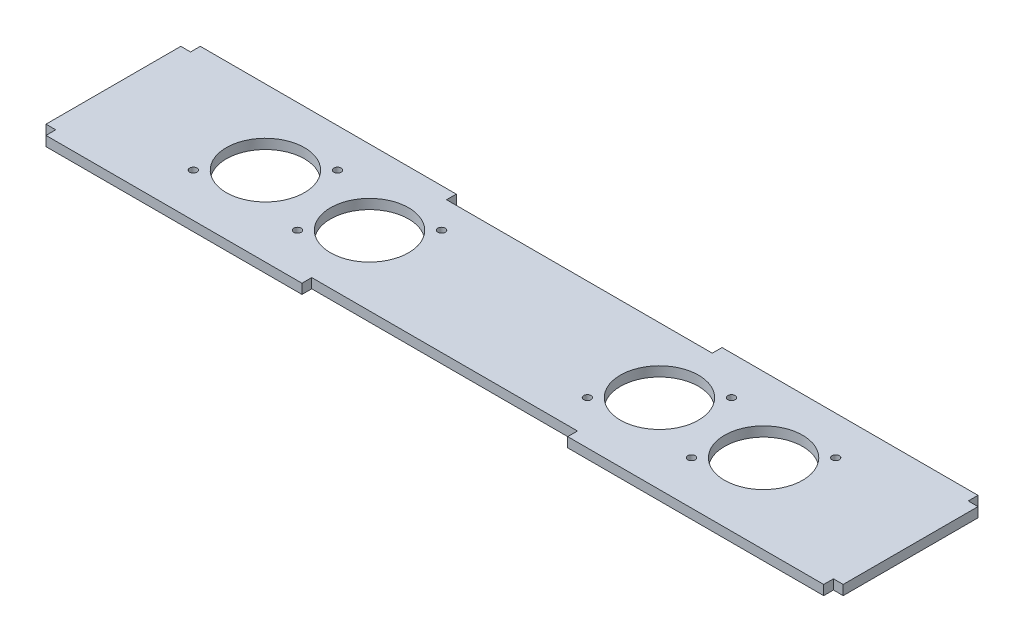
ISO-10303-21;
HEADER;
FILE_DESCRIPTION(('STEP AP214'),'2;1');
FILE_NAME('part.step','',(''),(''),'','','');
FILE_SCHEMA(('AUTOMOTIVE_DESIGN { 1 0 10303 214 1 1 1 1 }'));
ENDSEC;
DATA;
#1=APPLICATION_CONTEXT('core data for automotive mechanical design processes');
#2=APPLICATION_PROTOCOL_DEFINITION('international standard','automotive_design',2000,#1);
#3=PRODUCT_CONTEXT('',#1,'mechanical');
#4=PRODUCT('Part','Part','',(#3));
#5=PRODUCT_RELATED_PRODUCT_CATEGORY('part','',(#4));
#6=PRODUCT_DEFINITION_FORMATION('','',#4);
#7=PRODUCT_DEFINITION_CONTEXT('part definition',#1,'design');
#8=PRODUCT_DEFINITION('design','',#6,#7);
#9=PRODUCT_DEFINITION_SHAPE('','',#8);
#10=(LENGTH_UNIT() NAMED_UNIT(*) SI_UNIT(.MILLI.,.METRE.));
#11=(NAMED_UNIT(*) PLANE_ANGLE_UNIT() SI_UNIT($,.RADIAN.));
#12=(NAMED_UNIT(*) SI_UNIT($,.STERADIAN.) SOLID_ANGLE_UNIT());
#13=UNCERTAINTY_MEASURE_WITH_UNIT(LENGTH_MEASURE(1.E-05),#10,'distance_accuracy_value','');
#14=(GEOMETRIC_REPRESENTATION_CONTEXT(3) GLOBAL_UNCERTAINTY_ASSIGNED_CONTEXT((#13)) GLOBAL_UNIT_ASSIGNED_CONTEXT((#10,
#11,#12)) REPRESENTATION_CONTEXT('',''));
#15=CARTESIAN_POINT('',(0.,0.,0.));
#16=DIRECTION('',(0.,0.,1.));
#17=DIRECTION('',(1.,0.,0.));
#18=AXIS2_PLACEMENT_3D('',#15,#16,#17);
#19=CARTESIAN_POINT('',(0.,6.,0.));
#20=DIRECTION('',(0.,0.,-1.));
#21=DIRECTION('',(-1.,0.,0.));
#22=AXIS2_PLACEMENT_3D('',#19,#20,#21);
#23=PLANE('',#22);
#24=DIRECTION('',(1.,0.,0.));
#25=VECTOR('',#24,1.);
#26=CARTESIAN_POINT('',(0.,0.,0.));
#27=LINE('',#26,#25);
#28=CARTESIAN_POINT('',(6.00000000000002,0.,0.));
#29=VERTEX_POINT('',#28);
#30=CARTESIAN_POINT('',(163.333333333333,0.,0.));
#31=VERTEX_POINT('',#30);
#32=EDGE_CURVE('E188',#29,#31,#27,.T.);
#33=ORIENTED_EDGE('',*,*,#32,.T.);
#34=DIRECTION('',(0.,1.,0.));
#35=VECTOR('',#34,1.);
#36=CARTESIAN_POINT('',(163.333333333333,0.,0.));
#37=LINE('',#36,#35);
#38=CARTESIAN_POINT('',(163.333333333333,6.,0.));
#39=VERTEX_POINT('',#38);
#40=EDGE_CURVE('E172',#31,#39,#37,.T.);
#41=ORIENTED_EDGE('',*,*,#40,.T.);
#42=DIRECTION('',(1.,0.,0.));
#43=VECTOR('',#42,1.);
#44=CARTESIAN_POINT('',(0.,6.,0.));
#45=LINE('',#44,#43);
#46=CARTESIAN_POINT('',(6.00000000000002,6.,0.));
#47=VERTEX_POINT('',#46);
#48=EDGE_CURVE('E387',#47,#39,#45,.T.);
#49=ORIENTED_EDGE('',*,*,#48,.F.);
#50=DIRECTION('',(0.,1.,0.));
#51=VECTOR('',#50,1.);
#52=CARTESIAN_POINT('',(6.00000000000002,0.,0.));
#53=LINE('',#52,#51);
#54=EDGE_CURVE('E194',#29,#47,#53,.T.);
#55=ORIENTED_EDGE('',*,*,#54,.F.);
#56=EDGE_LOOP('',(#33,#41,#49,#55));
#57=FACE_BOUND('',#56,.T.);
#58=ADVANCED_FACE('F33',(#57),#23,.F.);
#59=CARTESIAN_POINT('',(0.,6.,-94.85));
#60=DIRECTION('',(0.,0.,1.));
#61=DIRECTION('',(1.,0.,0.));
#62=AXIS2_PLACEMENT_3D('',#59,#60,#61);
#63=PLANE('',#62);
#64=DIRECTION('',(-1.,0.,0.));
#65=VECTOR('',#64,1.);
#66=CARTESIAN_POINT('',(0.,6.,-94.85));
#67=LINE('',#66,#65);
#68=CARTESIAN_POINT('',(163.333333333333,6.,-94.85));
#69=VERTEX_POINT('',#68);
#70=CARTESIAN_POINT('',(6.00000000000001,6.,-94.8499999999999));
#71=VERTEX_POINT('',#70);
#72=EDGE_CURVE('E42',#69,#71,#67,.T.);
#73=ORIENTED_EDGE('',*,*,#72,.F.);
#74=DIRECTION('',(0.,1.,0.));
#75=VECTOR('',#74,1.);
#76=CARTESIAN_POINT('',(163.333333333333,0.,-94.85));
#77=LINE('',#76,#75);
#78=CARTESIAN_POINT('',(163.333333333333,0.,-94.85));
#79=VERTEX_POINT('',#78);
#80=EDGE_CURVE('E304',#79,#69,#77,.T.);
#81=ORIENTED_EDGE('',*,*,#80,.F.);
#82=DIRECTION('',(-1.,0.,0.));
#83=VECTOR('',#82,1.);
#84=CARTESIAN_POINT('',(0.,0.,-94.85));
#85=LINE('',#84,#83);
#86=CARTESIAN_POINT('',(6.00000000000001,0.,-94.8499999999999));
#87=VERTEX_POINT('',#86);
#88=EDGE_CURVE('E199',#79,#87,#85,.T.);
#89=ORIENTED_EDGE('',*,*,#88,.T.);
#90=DIRECTION('',(0.,1.,0.));
#91=VECTOR('',#90,1.);
#92=CARTESIAN_POINT('',(6.00000000000001,0.,-94.8499999999999));
#93=LINE('',#92,#91);
#94=EDGE_CURVE('E324',#87,#71,#93,.T.);
#95=ORIENTED_EDGE('',*,*,#94,.T.);
#96=EDGE_LOOP('',(#73,#81,#89,#95));
#97=FACE_BOUND('',#96,.T.);
#98=ADVANCED_FACE('F407',(#97),#63,.F.);
#99=CARTESIAN_POINT('',(0.,6.,0.));
#100=DIRECTION('',(1.,0.,0.));
#101=DIRECTION('',(0.,0.,-1.));
#102=AXIS2_PLACEMENT_3D('',#99,#100,#101);
#103=PLANE('',#102);
#104=DIRECTION('',(0.,0.,1.));
#105=VECTOR('',#104,1.);
#106=CARTESIAN_POINT('',(0.,6.,0.));
#107=LINE('',#106,#105);
#108=CARTESIAN_POINT('',(0.,6.,-88.8500000000001));
#109=VERTEX_POINT('',#108);
#110=CARTESIAN_POINT('',(0.,6.,-5.99999999999994));
#111=VERTEX_POINT('',#110);
#112=EDGE_CURVE('E207',#109,#111,#107,.T.);
#113=ORIENTED_EDGE('',*,*,#112,.F.);
#114=DIRECTION('',(0.,1.,0.));
#115=VECTOR('',#114,1.);
#116=CARTESIAN_POINT('',(0.,0.,-88.8500000000001));
#117=LINE('',#116,#115);
#118=CARTESIAN_POINT('',(0.,0.,-88.8500000000001));
#119=VERTEX_POINT('',#118);
#120=EDGE_CURVE('E340',#119,#109,#117,.T.);
#121=ORIENTED_EDGE('',*,*,#120,.F.);
#122=DIRECTION('',(0.,0.,1.));
#123=VECTOR('',#122,1.);
#124=CARTESIAN_POINT('',(0.,0.,0.));
#125=LINE('',#124,#123);
#126=CARTESIAN_POINT('',(0.,0.,-5.99999999999994));
#127=VERTEX_POINT('',#126);
#128=EDGE_CURVE('E201',#119,#127,#125,.T.);
#129=ORIENTED_EDGE('',*,*,#128,.T.);
#130=DIRECTION('',(0.,1.,0.));
#131=VECTOR('',#130,1.);
#132=CARTESIAN_POINT('',(0.,0.,-5.99999999999994));
#133=LINE('',#132,#131);
#134=EDGE_CURVE('E344',#127,#111,#133,.T.);
#135=ORIENTED_EDGE('',*,*,#134,.T.);
#136=EDGE_LOOP('',(#113,#121,#129,#135));
#137=FACE_BOUND('',#136,.T.);
#138=ADVANCED_FACE('F35',(#137),#103,.F.);
#139=CARTESIAN_POINT('',(326.666666666667,6.,0.));
#140=VERTEX_POINT('',#139);
#141=CARTESIAN_POINT('',(484.,6.,0.));
#142=VERTEX_POINT('',#141);
#143=EDGE_CURVE('E386',#140,#142,#45,.T.);
#144=ORIENTED_EDGE('',*,*,#143,.F.);
#145=DIRECTION('',(0.,1.,0.));
#146=VECTOR('',#145,1.);
#147=CARTESIAN_POINT('',(326.666666666667,0.,0.));
#148=LINE('',#147,#146);
#149=CARTESIAN_POINT('',(326.666666666667,0.,0.));
#150=VERTEX_POINT('',#149);
#151=EDGE_CURVE('E182',#150,#140,#148,.T.);
#152=ORIENTED_EDGE('',*,*,#151,.F.);
#153=CARTESIAN_POINT('',(484.,0.,0.));
#154=VERTEX_POINT('',#153);
#155=EDGE_CURVE('E196',#150,#154,#27,.T.);
#156=ORIENTED_EDGE('',*,*,#155,.T.);
#157=DIRECTION('',(0.,1.,0.));
#158=VECTOR('',#157,1.);
#159=CARTESIAN_POINT('',(484.,0.,0.));
#160=LINE('',#159,#158);
#161=EDGE_CURVE('E378',#154,#142,#160,.T.);
#162=ORIENTED_EDGE('',*,*,#161,.T.);
#163=EDGE_LOOP('',(#144,#152,#156,#162));
#164=FACE_BOUND('',#163,.T.);
#165=ADVANCED_FACE('F432',(#164),#23,.F.);
#166=CARTESIAN_POINT('',(490.,6.,0.));
#167=DIRECTION('',(-1.,0.,0.));
#168=DIRECTION('',(0.,0.,1.));
#169=AXIS2_PLACEMENT_3D('',#166,#167,#168);
#170=PLANE('',#169);
#171=DIRECTION('',(0.,0.,-1.));
#172=VECTOR('',#171,1.);
#173=CARTESIAN_POINT('',(490.,0.,0.));
#174=LINE('',#173,#172);
#175=CARTESIAN_POINT('',(490.,0.,-6.));
#176=VERTEX_POINT('',#175);
#177=CARTESIAN_POINT('',(490.,0.,-88.8500000000001));
#178=VERTEX_POINT('',#177);
#179=EDGE_CURVE('E195',#176,#178,#174,.T.);
#180=ORIENTED_EDGE('',*,*,#179,.T.);
#181=DIRECTION('',(0.,1.,0.));
#182=VECTOR('',#181,1.);
#183=CARTESIAN_POINT('',(490.,0.,-88.8500000000001));
#184=LINE('',#183,#182);
#185=CARTESIAN_POINT('',(490.,6.,-88.8500000000001));
#186=VERTEX_POINT('',#185);
#187=EDGE_CURVE('E326',#178,#186,#184,.T.);
#188=ORIENTED_EDGE('',*,*,#187,.T.);
#189=DIRECTION('',(0.,0.,-1.));
#190=VECTOR('',#189,1.);
#191=CARTESIAN_POINT('',(490.,6.,0.));
#192=LINE('',#191,#190);
#193=CARTESIAN_POINT('',(490.,6.,-6.));
#194=VERTEX_POINT('',#193);
#195=EDGE_CURVE('E389',#194,#186,#192,.T.);
#196=ORIENTED_EDGE('',*,*,#195,.F.);
#197=DIRECTION('',(0.,1.,0.));
#198=VECTOR('',#197,1.);
#199=CARTESIAN_POINT('',(490.,0.,-6.));
#200=LINE('',#199,#198);
#201=EDGE_CURVE('E373',#176,#194,#200,.T.);
#202=ORIENTED_EDGE('',*,*,#201,.F.);
#203=EDGE_LOOP('',(#180,#188,#196,#202));
#204=FACE_BOUND('',#203,.T.);
#205=ADVANCED_FACE('F443',(#204),#170,.F.);
#206=CARTESIAN_POINT('',(484.,0.,-94.85));
#207=VERTEX_POINT('',#206);
#208=CARTESIAN_POINT('',(326.666666666667,0.,-94.85));
#209=VERTEX_POINT('',#208);
#210=EDGE_CURVE('E204',#207,#209,#85,.T.);
#211=ORIENTED_EDGE('',*,*,#210,.T.);
#212=DIRECTION('',(0.,1.,0.));
#213=VECTOR('',#212,1.);
#214=CARTESIAN_POINT('',(326.666666666667,0.,-94.85));
#215=LINE('',#214,#213);
#216=CARTESIAN_POINT('',(326.666666666667,6.,-94.85));
#217=VERTEX_POINT('',#216);
#218=EDGE_CURVE('E307',#209,#217,#215,.T.);
#219=ORIENTED_EDGE('',*,*,#218,.T.);
#220=CARTESIAN_POINT('',(484.,6.,-94.85));
#221=VERTEX_POINT('',#220);
#222=EDGE_CURVE('E11',#221,#217,#67,.T.);
#223=ORIENTED_EDGE('',*,*,#222,.F.);
#224=DIRECTION('',(0.,1.,0.));
#225=VECTOR('',#224,1.);
#226=CARTESIAN_POINT('',(484.,0.,-94.85));
#227=LINE('',#226,#225);
#228=EDGE_CURVE('E320',#207,#221,#227,.T.);
#229=ORIENTED_EDGE('',*,*,#228,.F.);
#230=EDGE_LOOP('',(#211,#219,#223,#229));
#231=FACE_BOUND('',#230,.T.);
#232=ADVANCED_FACE('F454',(#231),#63,.F.);
#233=CARTESIAN_POINT('',(0.,6.,0.));
#234=DIRECTION('',(0.,-1.,0.));
#235=DIRECTION('',(0.,0.,-1.));
#236=AXIS2_PLACEMENT_3D('',#233,#234,#235);
#237=PLANE('',#236);
#238=CARTESIAN_POINT('',(91.8979166304964,6.,-48.9562509768696));
#239=DIRECTION('',(0.,1.,0.));
#240=DIRECTION('',(0.,0.,1.));
#241=AXIS2_PLACEMENT_3D('',#238,#239,#240);
#242=CIRCLE('',#241,24.);
#243=CARTESIAN_POINT('',(91.8979166304964,6.,-24.9562509768696));
#244=VERTEX_POINT('',#243);
#245=EDGE_CURVE('E696',#244,#244,#242,.T.);
#246=ORIENTED_EDGE('',*,*,#245,.F.);
#247=EDGE_LOOP('',(#246));
#248=FACE_BOUND('',#247,.T.);
#249=CARTESIAN_POINT('',(155.897916630496,6.,-48.9562509768697));
#250=DIRECTION('',(0.,1.,0.));
#251=DIRECTION('',(0.,0.,1.));
#252=AXIS2_PLACEMENT_3D('',#249,#250,#251);
#253=CIRCLE('',#252,24.);
#254=CARTESIAN_POINT('',(155.897916630496,6.,-24.9562509768697));
#255=VERTEX_POINT('',#254);
#256=EDGE_CURVE('E229',#255,#255,#253,.T.);
#257=ORIENTED_EDGE('',*,*,#256,.F.);
#258=EDGE_LOOP('',(#257));
#259=FACE_BOUND('',#258,.T.);
#260=CARTESIAN_POINT('',(334.102083369504,6.,-48.9562509768697));
#261=DIRECTION('',(0.,1.,0.));
#262=DIRECTION('',(0.,0.,1.));
#263=AXIS2_PLACEMENT_3D('',#260,#261,#262);
#264=CIRCLE('',#263,24.);
#265=CARTESIAN_POINT('',(334.102083369504,6.,-24.9562509768697));
#266=VERTEX_POINT('',#265);
#267=EDGE_CURVE('E219',#266,#266,#264,.T.);
#268=ORIENTED_EDGE('',*,*,#267,.F.);
#269=EDGE_LOOP('',(#268));
#270=FACE_BOUND('',#269,.T.);
#271=CARTESIAN_POINT('',(398.102083369504,6.,-48.9562509768698));
#272=DIRECTION('',(0.,1.,0.));
#273=DIRECTION('',(0.,0.,1.));
#274=AXIS2_PLACEMENT_3D('',#271,#272,#273);
#275=CIRCLE('',#274,24.);
#276=CARTESIAN_POINT('',(398.102083369504,6.,-24.9562509768698));
#277=VERTEX_POINT('',#276);
#278=EDGE_CURVE('E216',#277,#277,#275,.T.);
#279=ORIENTED_EDGE('',*,*,#278,.F.);
#280=EDGE_LOOP('',(#279));
#281=FACE_BOUND('',#280,.T.);
#282=CARTESIAN_POINT('',(375.952083369504,6.,-26.8062509768698));
#283=DIRECTION('',(0.,1.,0.));
#284=DIRECTION('',(0.,0.,1.));
#285=AXIS2_PLACEMENT_3D('',#282,#283,#284);
#286=CIRCLE('',#285,2.24999999999997);
#287=CARTESIAN_POINT('',(375.952083369504,6.,-24.5562509768699));
#288=VERTEX_POINT('',#287);
#289=EDGE_CURVE('E215',#288,#288,#286,.T.);
#290=ORIENTED_EDGE('',*,*,#289,.F.);
#291=EDGE_LOOP('',(#290));
#292=FACE_BOUND('',#291,.T.);
#293=CARTESIAN_POINT('',(420.252083369504,6.,-71.1062509768698));
#294=DIRECTION('',(0.,1.,0.));
#295=DIRECTION('',(0.,0.,1.));
#296=AXIS2_PLACEMENT_3D('',#293,#294,#295);
#297=CIRCLE('',#296,2.24999999999997);
#298=CARTESIAN_POINT('',(420.252083369504,6.,-68.8562509768699));
#299=VERTEX_POINT('',#298);
#300=EDGE_CURVE('E212',#299,#299,#297,.T.);
#301=ORIENTED_EDGE('',*,*,#300,.F.);
#302=EDGE_LOOP('',(#301));
#303=FACE_BOUND('',#302,.T.);
#304=CARTESIAN_POINT('',(356.252083369504,6.,-71.1062509768697));
#305=DIRECTION('',(0.,1.,0.));
#306=DIRECTION('',(0.,0.,1.));
#307=AXIS2_PLACEMENT_3D('',#304,#305,#306);
#308=CIRCLE('',#307,2.24999999999997);
#309=CARTESIAN_POINT('',(356.252083369504,6.,-68.8562509768698));
#310=VERTEX_POINT('',#309);
#311=EDGE_CURVE('E211',#310,#310,#308,.T.);
#312=ORIENTED_EDGE('',*,*,#311,.F.);
#313=EDGE_LOOP('',(#312));
#314=FACE_BOUND('',#313,.T.);
#315=CARTESIAN_POINT('',(311.952083369504,6.,-26.8062509768697));
#316=DIRECTION('',(0.,1.,0.));
#317=DIRECTION('',(0.,0.,1.));
#318=AXIS2_PLACEMENT_3D('',#315,#316,#317);
#319=CIRCLE('',#318,2.24999999999997);
#320=CARTESIAN_POINT('',(311.952083369504,6.,-24.5562509768698));
#321=VERTEX_POINT('',#320);
#322=EDGE_CURVE('E245',#321,#321,#319,.T.);
#323=ORIENTED_EDGE('',*,*,#322,.F.);
#324=EDGE_LOOP('',(#323));
#325=FACE_BOUND('',#324,.T.);
#326=CARTESIAN_POINT('',(178.047916630496,6.,-71.1062509768697));
#327=DIRECTION('',(0.,1.,0.));
#328=DIRECTION('',(0.,0.,1.));
#329=AXIS2_PLACEMENT_3D('',#326,#327,#328);
#330=CIRCLE('',#329,2.25);
#331=CARTESIAN_POINT('',(178.047916630496,6.,-68.8562509768697));
#332=VERTEX_POINT('',#331);
#333=EDGE_CURVE('E251',#332,#332,#330,.T.);
#334=ORIENTED_EDGE('',*,*,#333,.F.);
#335=EDGE_LOOP('',(#334));
#336=FACE_BOUND('',#335,.T.);
#337=CARTESIAN_POINT('',(133.747916630496,6.,-26.8062509768697));
#338=DIRECTION('',(0.,1.,0.));
#339=DIRECTION('',(0.,0.,1.));
#340=AXIS2_PLACEMENT_3D('',#337,#338,#339);
#341=CIRCLE('',#340,2.25);
#342=CARTESIAN_POINT('',(133.747916630496,6.,-24.5562509768697));
#343=VERTEX_POINT('',#342);
#344=EDGE_CURVE('E257',#343,#343,#341,.T.);
#345=ORIENTED_EDGE('',*,*,#344,.F.);
#346=EDGE_LOOP('',(#345));
#347=FACE_BOUND('',#346,.T.);
#348=CARTESIAN_POINT('',(114.047916630496,6.,-71.1062509768696));
#349=DIRECTION('',(0.,1.,0.));
#350=DIRECTION('',(0.,0.,1.));
#351=AXIS2_PLACEMENT_3D('',#348,#349,#350);
#352=CIRCLE('',#351,2.25);
#353=CARTESIAN_POINT('',(114.047916630496,6.,-68.8562509768696));
#354=VERTEX_POINT('',#353);
#355=EDGE_CURVE('E263',#354,#354,#352,.T.);
#356=ORIENTED_EDGE('',*,*,#355,.F.);
#357=EDGE_LOOP('',(#356));
#358=FACE_BOUND('',#357,.T.);
#359=CARTESIAN_POINT('',(69.7479166304964,6.,-26.8062509768696));
#360=DIRECTION('',(0.,1.,0.));
#361=DIRECTION('',(0.,0.,1.));
#362=AXIS2_PLACEMENT_3D('',#359,#360,#361);
#363=CIRCLE('',#362,2.25);
#364=CARTESIAN_POINT('',(69.7479166304964,6.,-24.5562509768696));
#365=VERTEX_POINT('',#364);
#366=EDGE_CURVE('E269',#365,#365,#363,.T.);
#367=ORIENTED_EDGE('',*,*,#366,.F.);
#368=EDGE_LOOP('',(#367));
#369=FACE_BOUND('',#368,.T.);
#370=ORIENTED_EDGE('',*,*,#48,.T.);
#371=DIRECTION('',(0.,0.,1.));
#372=VECTOR('',#371,1.);
#373=CARTESIAN_POINT('',(163.333333333333,6.,0.));
#374=LINE('',#373,#372);
#375=CARTESIAN_POINT('',(163.333333333333,6.,-6.00000000000001));
#376=VERTEX_POINT('',#375);
#377=EDGE_CURVE('E177',#376,#39,#374,.T.);
#378=ORIENTED_EDGE('',*,*,#377,.F.);
#379=DIRECTION('',(-1.,0.,0.));
#380=VECTOR('',#379,1.);
#381=CARTESIAN_POINT('',(163.333333333333,6.,-6.00000000000001));
#382=LINE('',#381,#380);
#383=CARTESIAN_POINT('',(326.666666666667,6.,-6.));
#384=VERTEX_POINT('',#383);
#385=EDGE_CURVE('E191',#384,#376,#382,.T.);
#386=ORIENTED_EDGE('',*,*,#385,.F.);
#387=DIRECTION('',(0.,0.,-1.));
#388=VECTOR('',#387,1.);
#389=CARTESIAN_POINT('',(326.666666666667,6.,0.));
#390=LINE('',#389,#388);
#391=EDGE_CURVE('E278',#140,#384,#390,.T.);
#392=ORIENTED_EDGE('',*,*,#391,.F.);
#393=ORIENTED_EDGE('',*,*,#143,.T.);
#394=DIRECTION('',(0.,0.,1.));
#395=VECTOR('',#394,1.);
#396=CARTESIAN_POINT('',(484.,6.,0.));
#397=LINE('',#396,#395);
#398=CARTESIAN_POINT('',(484.,6.,-6.));
#399=VERTEX_POINT('',#398);
#400=EDGE_CURVE('E370',#399,#142,#397,.T.);
#401=ORIENTED_EDGE('',*,*,#400,.F.);
#402=DIRECTION('',(-1.,0.,0.));
#403=VECTOR('',#402,1.);
#404=CARTESIAN_POINT('',(490.,6.,-6.));
#405=LINE('',#404,#403);
#406=EDGE_CURVE('E329',#194,#399,#405,.T.);
#407=ORIENTED_EDGE('',*,*,#406,.F.);
#408=ORIENTED_EDGE('',*,*,#195,.T.);
#409=DIRECTION('',(1.,0.,0.));
#410=VECTOR('',#409,1.);
#411=CARTESIAN_POINT('',(490.,6.,-88.8500000000001));
#412=LINE('',#411,#410);
#413=CARTESIAN_POINT('',(484.,6.,-88.8500000000001));
#414=VERTEX_POINT('',#413);
#415=EDGE_CURVE('E317',#414,#186,#412,.T.);
#416=ORIENTED_EDGE('',*,*,#415,.F.);
#417=DIRECTION('',(0.,0.,1.));
#418=VECTOR('',#417,1.);
#419=CARTESIAN_POINT('',(484.,6.,-94.85));
#420=LINE('',#419,#418);
#421=EDGE_CURVE('E321',#221,#414,#420,.T.);
#422=ORIENTED_EDGE('',*,*,#421,.F.);
#423=ORIENTED_EDGE('',*,*,#222,.T.);
#424=DIRECTION('',(0.,0.,-1.));
#425=VECTOR('',#424,1.);
#426=CARTESIAN_POINT('',(326.666666666667,6.,-94.85));
#427=LINE('',#426,#425);
#428=CARTESIAN_POINT('',(326.666666666667,6.,-88.85));
#429=VERTEX_POINT('',#428);
#430=EDGE_CURVE('E293',#429,#217,#427,.T.);
#431=ORIENTED_EDGE('',*,*,#430,.F.);
#432=DIRECTION('',(1.,0.,0.));
#433=VECTOR('',#432,1.);
#434=CARTESIAN_POINT('',(163.333333333333,6.,-88.85));
#435=LINE('',#434,#433);
#436=CARTESIAN_POINT('',(163.333333333333,6.,-88.85));
#437=VERTEX_POINT('',#436);
#438=EDGE_CURVE('E300',#437,#429,#435,.T.);
#439=ORIENTED_EDGE('',*,*,#438,.F.);
#440=DIRECTION('',(0.,0.,1.));
#441=VECTOR('',#440,1.);
#442=CARTESIAN_POINT('',(163.333333333333,6.,-94.85));
#443=LINE('',#442,#441);
#444=EDGE_CURVE('E285',#69,#437,#443,.T.);
#445=ORIENTED_EDGE('',*,*,#444,.F.);
#446=ORIENTED_EDGE('',*,*,#72,.T.);
#447=DIRECTION('',(0.,0.,-1.));
#448=VECTOR('',#447,1.);
#449=CARTESIAN_POINT('',(6.00000000000001,6.,-94.8499999999999));
#450=LINE('',#449,#448);
#451=CARTESIAN_POINT('',(6.00000000000001,6.,-88.8500000000001));
#452=VERTEX_POINT('',#451);
#453=EDGE_CURVE('E337',#452,#71,#450,.T.);
#454=ORIENTED_EDGE('',*,*,#453,.F.);
#455=DIRECTION('',(1.,0.,0.));
#456=VECTOR('',#455,1.);
#457=CARTESIAN_POINT('',(0.,6.,-88.8500000000001));
#458=LINE('',#457,#456);
#459=EDGE_CURVE('E341',#109,#452,#458,.T.);
#460=ORIENTED_EDGE('',*,*,#459,.F.);
#461=ORIENTED_EDGE('',*,*,#112,.T.);
#462=DIRECTION('',(-1.,0.,0.));
#463=VECTOR('',#462,1.);
#464=CARTESIAN_POINT('',(0.,6.,-5.99999999999994));
#465=LINE('',#464,#463);
#466=CARTESIAN_POINT('',(6.00000000000002,6.,-5.99999999999994));
#467=VERTEX_POINT('',#466);
#468=EDGE_CURVE('E355',#467,#111,#465,.T.);
#469=ORIENTED_EDGE('',*,*,#468,.F.);
#470=DIRECTION('',(0.,0.,-1.));
#471=VECTOR('',#470,1.);
#472=CARTESIAN_POINT('',(6.00000000000002,6.,0.));
#473=LINE('',#472,#471);
#474=EDGE_CURVE('E306',#47,#467,#473,.T.);
#475=ORIENTED_EDGE('',*,*,#474,.F.);
#476=EDGE_LOOP('',(#370,#378,#386,#392,#393,#401,#407,#408,#416,#422,#423,#431,#439,#445,#446,
#454,#460,#461,#469,#475));
#477=FACE_BOUND('',#476,.T.);
#478=ADVANCED_FACE('F398',(#248,#259,#270,#281,#292,#303,#314,#325,#336,#347,#358,#369,#477),
#237,.F.);
#479=CARTESIAN_POINT('',(0.,0.,0.));
#480=DIRECTION('',(0.,-1.,0.));
#481=DIRECTION('',(0.,0.,-1.));
#482=AXIS2_PLACEMENT_3D('',#479,#480,#481);
#483=PLANE('',#482);
#484=CARTESIAN_POINT('',(91.8979166304964,0.,-48.9562509768696));
#485=DIRECTION('',(0.,-1.,0.));
#486=DIRECTION('',(0.,0.,-1.));
#487=AXIS2_PLACEMENT_3D('',#484,#485,#486);
#488=CIRCLE('',#487,24.);
#489=CARTESIAN_POINT('',(91.8979166304964,0.,-72.9562509768696));
#490=VERTEX_POINT('',#489);
#491=EDGE_CURVE('E693',#490,#490,#488,.T.);
#492=ORIENTED_EDGE('',*,*,#491,.F.);
#493=EDGE_LOOP('',(#492));
#494=FACE_BOUND('',#493,.T.);
#495=CARTESIAN_POINT('',(155.897916630496,0.,-48.9562509768697));
#496=DIRECTION('',(0.,-1.,0.));
#497=DIRECTION('',(0.,0.,-1.));
#498=AXIS2_PLACEMENT_3D('',#495,#496,#497);
#499=CIRCLE('',#498,24.);
#500=CARTESIAN_POINT('',(155.897916630496,0.,-72.9562509768697));
#501=VERTEX_POINT('',#500);
#502=EDGE_CURVE('E37',#501,#501,#499,.T.);
#503=ORIENTED_EDGE('',*,*,#502,.F.);
#504=EDGE_LOOP('',(#503));
#505=FACE_BOUND('',#504,.T.);
#506=CARTESIAN_POINT('',(334.102083369504,0.,-48.9562509768697));
#507=DIRECTION('',(0.,-1.,0.));
#508=DIRECTION('',(0.,0.,-1.));
#509=AXIS2_PLACEMENT_3D('',#506,#507,#508);
#510=CIRCLE('',#509,24.);
#511=CARTESIAN_POINT('',(334.102083369504,0.,-72.9562509768697));
#512=VERTEX_POINT('',#511);
#513=EDGE_CURVE('E217',#512,#512,#510,.T.);
#514=ORIENTED_EDGE('',*,*,#513,.F.);
#515=EDGE_LOOP('',(#514));
#516=FACE_BOUND('',#515,.T.);
#517=CARTESIAN_POINT('',(398.102083369504,0.,-48.9562509768698));
#518=DIRECTION('',(0.,-1.,0.));
#519=DIRECTION('',(0.,0.,-1.));
#520=AXIS2_PLACEMENT_3D('',#517,#518,#519);
#521=CIRCLE('',#520,24.);
#522=CARTESIAN_POINT('',(398.102083369504,0.,-72.9562509768699));
#523=VERTEX_POINT('',#522);
#524=EDGE_CURVE('E213',#523,#523,#521,.T.);
#525=ORIENTED_EDGE('',*,*,#524,.F.);
#526=EDGE_LOOP('',(#525));
#527=FACE_BOUND('',#526,.T.);
#528=CARTESIAN_POINT('',(375.952083369504,0.,-26.8062509768698));
#529=DIRECTION('',(0.,-1.,0.));
#530=DIRECTION('',(0.,0.,-1.));
#531=AXIS2_PLACEMENT_3D('',#528,#529,#530);
#532=CIRCLE('',#531,2.24999999999997);
#533=CARTESIAN_POINT('',(375.952083369504,0.,-29.0562509768698));
#534=VERTEX_POINT('',#533);
#535=EDGE_CURVE('E235',#534,#534,#532,.T.);
#536=ORIENTED_EDGE('',*,*,#535,.F.);
#537=EDGE_LOOP('',(#536));
#538=FACE_BOUND('',#537,.T.);
#539=CARTESIAN_POINT('',(420.252083369504,0.,-71.1062509768698));
#540=DIRECTION('',(0.,-1.,0.));
#541=DIRECTION('',(0.,0.,-1.));
#542=AXIS2_PLACEMENT_3D('',#539,#540,#541);
#543=CIRCLE('',#542,2.24999999999997);
#544=CARTESIAN_POINT('',(420.252083369504,0.,-73.3562509768698));
#545=VERTEX_POINT('',#544);
#546=EDGE_CURVE('E208',#545,#545,#543,.T.);
#547=ORIENTED_EDGE('',*,*,#546,.F.);
#548=EDGE_LOOP('',(#547));
#549=FACE_BOUND('',#548,.T.);
#550=CARTESIAN_POINT('',(356.252083369504,0.,-71.1062509768697));
#551=DIRECTION('',(0.,-1.,0.));
#552=DIRECTION('',(0.,0.,-1.));
#553=AXIS2_PLACEMENT_3D('',#550,#551,#552);
#554=CIRCLE('',#553,2.24999999999997);
#555=CARTESIAN_POINT('',(356.252083369504,0.,-73.3562509768697));
#556=VERTEX_POINT('',#555);
#557=EDGE_CURVE('E242',#556,#556,#554,.T.);
#558=ORIENTED_EDGE('',*,*,#557,.F.);
#559=EDGE_LOOP('',(#558));
#560=FACE_BOUND('',#559,.T.);
#561=CARTESIAN_POINT('',(311.952083369504,0.,-26.8062509768697));
#562=DIRECTION('',(0.,-1.,0.));
#563=DIRECTION('',(0.,0.,-1.));
#564=AXIS2_PLACEMENT_3D('',#561,#562,#563);
#565=CIRCLE('',#564,2.24999999999997);
#566=CARTESIAN_POINT('',(311.952083369504,0.,-29.0562509768697));
#567=VERTEX_POINT('',#566);
#568=EDGE_CURVE('E248',#567,#567,#565,.T.);
#569=ORIENTED_EDGE('',*,*,#568,.F.);
#570=EDGE_LOOP('',(#569));
#571=FACE_BOUND('',#570,.T.);
#572=CARTESIAN_POINT('',(178.047916630496,0.,-71.1062509768697));
#573=DIRECTION('',(0.,-1.,0.));
#574=DIRECTION('',(0.,0.,-1.));
#575=AXIS2_PLACEMENT_3D('',#572,#573,#574);
#576=CIRCLE('',#575,2.25);
#577=CARTESIAN_POINT('',(178.047916630496,0.,-73.3562509768697));
#578=VERTEX_POINT('',#577);
#579=EDGE_CURVE('E254',#578,#578,#576,.T.);
#580=ORIENTED_EDGE('',*,*,#579,.F.);
#581=EDGE_LOOP('',(#580));
#582=FACE_BOUND('',#581,.T.);
#583=CARTESIAN_POINT('',(133.747916630496,0.,-26.8062509768697));
#584=DIRECTION('',(0.,-1.,0.));
#585=DIRECTION('',(0.,0.,-1.));
#586=AXIS2_PLACEMENT_3D('',#583,#584,#585);
#587=CIRCLE('',#586,2.25);
#588=CARTESIAN_POINT('',(133.747916630496,0.,-29.0562509768697));
#589=VERTEX_POINT('',#588);
#590=EDGE_CURVE('E260',#589,#589,#587,.T.);
#591=ORIENTED_EDGE('',*,*,#590,.F.);
#592=EDGE_LOOP('',(#591));
#593=FACE_BOUND('',#592,.T.);
#594=CARTESIAN_POINT('',(114.047916630496,0.,-71.1062509768696));
#595=DIRECTION('',(0.,-1.,0.));
#596=DIRECTION('',(0.,0.,-1.));
#597=AXIS2_PLACEMENT_3D('',#594,#595,#596);
#598=CIRCLE('',#597,2.25);
#599=CARTESIAN_POINT('',(114.047916630496,0.,-73.3562509768696));
#600=VERTEX_POINT('',#599);
#601=EDGE_CURVE('E266',#600,#600,#598,.T.);
#602=ORIENTED_EDGE('',*,*,#601,.F.);
#603=EDGE_LOOP('',(#602));
#604=FACE_BOUND('',#603,.T.);
#605=CARTESIAN_POINT('',(69.7479166304964,0.,-26.8062509768696));
#606=DIRECTION('',(0.,-1.,0.));
#607=DIRECTION('',(0.,0.,-1.));
#608=AXIS2_PLACEMENT_3D('',#605,#606,#607);
#609=CIRCLE('',#608,2.25);
#610=CARTESIAN_POINT('',(69.7479166304964,0.,-29.0562509768696));
#611=VERTEX_POINT('',#610);
#612=EDGE_CURVE('E272',#611,#611,#609,.T.);
#613=ORIENTED_EDGE('',*,*,#612,.F.);
#614=EDGE_LOOP('',(#613));
#615=FACE_BOUND('',#614,.T.);
#616=DIRECTION('',(0.,0.,1.));
#617=VECTOR('',#616,1.);
#618=CARTESIAN_POINT('',(163.333333333333,0.,0.));
#619=LINE('',#618,#617);
#620=CARTESIAN_POINT('',(163.333333333333,0.,-6.00000000000001));
#621=VERTEX_POINT('',#620);
#622=EDGE_CURVE('E175',#621,#31,#619,.T.);
#623=ORIENTED_EDGE('',*,*,#622,.T.);
#624=ORIENTED_EDGE('',*,*,#32,.F.);
#625=DIRECTION('',(0.,0.,-1.));
#626=VECTOR('',#625,1.);
#627=CARTESIAN_POINT('',(6.00000000000002,0.,0.));
#628=LINE('',#627,#626);
#629=CARTESIAN_POINT('',(6.00000000000002,0.,-5.99999999999994));
#630=VERTEX_POINT('',#629);
#631=EDGE_CURVE('E352',#29,#630,#628,.T.);
#632=ORIENTED_EDGE('',*,*,#631,.T.);
#633=DIRECTION('',(-1.,0.,0.));
#634=VECTOR('',#633,1.);
#635=CARTESIAN_POINT('',(0.,0.,-5.99999999999994));
#636=LINE('',#635,#634);
#637=EDGE_CURVE('E354',#630,#127,#636,.T.);
#638=ORIENTED_EDGE('',*,*,#637,.T.);
#639=ORIENTED_EDGE('',*,*,#128,.F.);
#640=DIRECTION('',(1.,0.,0.));
#641=VECTOR('',#640,1.);
#642=CARTESIAN_POINT('',(0.,0.,-88.8500000000001));
#643=LINE('',#642,#641);
#644=CARTESIAN_POINT('',(6.00000000000001,0.,-88.8500000000001));
#645=VERTEX_POINT('',#644);
#646=EDGE_CURVE('E333',#119,#645,#643,.T.);
#647=ORIENTED_EDGE('',*,*,#646,.T.);
#648=DIRECTION('',(0.,0.,-1.));
#649=VECTOR('',#648,1.);
#650=CARTESIAN_POINT('',(6.00000000000001,0.,-94.8499999999999));
#651=LINE('',#650,#649);
#652=EDGE_CURVE('E336',#645,#87,#651,.T.);
#653=ORIENTED_EDGE('',*,*,#652,.T.);
#654=ORIENTED_EDGE('',*,*,#88,.F.);
#655=DIRECTION('',(0.,0.,1.));
#656=VECTOR('',#655,1.);
#657=CARTESIAN_POINT('',(163.333333333333,0.,-94.85));
#658=LINE('',#657,#656);
#659=CARTESIAN_POINT('',(163.333333333333,0.,-88.85));
#660=VERTEX_POINT('',#659);
#661=EDGE_CURVE('E289',#79,#660,#658,.T.);
#662=ORIENTED_EDGE('',*,*,#661,.T.);
#663=DIRECTION('',(1.,0.,0.));
#664=VECTOR('',#663,1.);
#665=CARTESIAN_POINT('',(163.333333333333,0.,-88.85));
#666=LINE('',#665,#664);
#667=CARTESIAN_POINT('',(326.666666666667,0.,-88.85));
#668=VERTEX_POINT('',#667);
#669=EDGE_CURVE('E292',#660,#668,#666,.T.);
#670=ORIENTED_EDGE('',*,*,#669,.T.);
#671=DIRECTION('',(0.,0.,-1.));
#672=VECTOR('',#671,1.);
#673=CARTESIAN_POINT('',(326.666666666667,0.,-94.85));
#674=LINE('',#673,#672);
#675=EDGE_CURVE('E58',#668,#209,#674,.T.);
#676=ORIENTED_EDGE('',*,*,#675,.T.);
#677=ORIENTED_EDGE('',*,*,#210,.F.);
#678=DIRECTION('',(0.,0.,1.));
#679=VECTOR('',#678,1.);
#680=CARTESIAN_POINT('',(484.,0.,-94.85));
#681=LINE('',#680,#679);
#682=CARTESIAN_POINT('',(484.,0.,-88.8500000000001));
#683=VERTEX_POINT('',#682);
#684=EDGE_CURVE('E313',#207,#683,#681,.T.);
#685=ORIENTED_EDGE('',*,*,#684,.T.);
#686=DIRECTION('',(1.,0.,0.));
#687=VECTOR('',#686,1.);
#688=CARTESIAN_POINT('',(490.,0.,-88.8500000000001));
#689=LINE('',#688,#687);
#690=EDGE_CURVE('E316',#683,#178,#689,.T.);
#691=ORIENTED_EDGE('',*,*,#690,.T.);
#692=ORIENTED_EDGE('',*,*,#179,.F.);
#693=DIRECTION('',(-1.,0.,0.));
#694=VECTOR('',#693,1.);
#695=CARTESIAN_POINT('',(490.,0.,-6.));
#696=LINE('',#695,#694);
#697=CARTESIAN_POINT('',(484.,0.,-6.));
#698=VERTEX_POINT('',#697);
#699=EDGE_CURVE('E366',#176,#698,#696,.T.);
#700=ORIENTED_EDGE('',*,*,#699,.T.);
#701=DIRECTION('',(0.,0.,1.));
#702=VECTOR('',#701,1.);
#703=CARTESIAN_POINT('',(484.,0.,0.));
#704=LINE('',#703,#702);
#705=EDGE_CURVE('E369',#698,#154,#704,.T.);
#706=ORIENTED_EDGE('',*,*,#705,.T.);
#707=ORIENTED_EDGE('',*,*,#155,.F.);
#708=DIRECTION('',(0.,0.,-1.));
#709=VECTOR('',#708,1.);
#710=CARTESIAN_POINT('',(326.666666666667,0.,0.));
#711=LINE('',#710,#709);
#712=CARTESIAN_POINT('',(326.666666666667,0.,-6.));
#713=VERTEX_POINT('',#712);
#714=EDGE_CURVE('E190',#150,#713,#711,.T.);
#715=ORIENTED_EDGE('',*,*,#714,.T.);
#716=DIRECTION('',(-1.,0.,0.));
#717=VECTOR('',#716,1.);
#718=CARTESIAN_POINT('',(163.333333333333,0.,-6.00000000000001));
#719=LINE('',#718,#717);
#720=EDGE_CURVE('E50',#713,#621,#719,.T.);
#721=ORIENTED_EDGE('',*,*,#720,.T.);
#722=EDGE_LOOP('',(#623,#624,#632,#638,#639,#647,#653,#654,#662,#670,#676,#677,#685,#691,#692,
#700,#706,#707,#715,#721));
#723=FACE_BOUND('',#722,.T.);
#724=ADVANCED_FACE('F186',(#494,#505,#516,#527,#538,#549,#560,#571,#582,#593,#604,#615,#723),
#483,.T.);
#725=CARTESIAN_POINT('',(484.,0.,0.));
#726=DIRECTION('',(-1.,0.,0.));
#727=DIRECTION('',(0.,0.,1.));
#728=AXIS2_PLACEMENT_3D('',#725,#726,#727);
#729=PLANE('',#728);
#730=ORIENTED_EDGE('',*,*,#400,.T.);
#731=ORIENTED_EDGE('',*,*,#161,.F.);
#732=ORIENTED_EDGE('',*,*,#705,.F.);
#733=DIRECTION('',(0.,1.,0.));
#734=VECTOR('',#733,1.);
#735=CARTESIAN_POINT('',(484.,0.,-6.));
#736=LINE('',#735,#734);
#737=EDGE_CURVE('E381',#698,#399,#736,.T.);
#738=ORIENTED_EDGE('',*,*,#737,.T.);
#739=EDGE_LOOP('',(#730,#731,#732,#738));
#740=FACE_BOUND('',#739,.T.);
#741=ADVANCED_FACE('F437',(#740),#729,.F.);
#742=CARTESIAN_POINT('',(490.,0.,-6.));
#743=DIRECTION('',(0.,0.,-1.));
#744=DIRECTION('',(-1.,0.,0.));
#745=AXIS2_PLACEMENT_3D('',#742,#743,#744);
#746=PLANE('',#745);
#747=ORIENTED_EDGE('',*,*,#406,.T.);
#748=ORIENTED_EDGE('',*,*,#737,.F.);
#749=ORIENTED_EDGE('',*,*,#699,.F.);
#750=ORIENTED_EDGE('',*,*,#201,.T.);
#751=EDGE_LOOP('',(#747,#748,#749,#750));
#752=FACE_BOUND('',#751,.T.);
#753=ADVANCED_FACE('F439',(#752),#746,.F.);
#754=CARTESIAN_POINT('',(0.,0.,-5.99999999999994));
#755=DIRECTION('',(0.,0.,-1.));
#756=DIRECTION('',(-1.,0.,0.));
#757=AXIS2_PLACEMENT_3D('',#754,#755,#756);
#758=PLANE('',#757);
#759=ORIENTED_EDGE('',*,*,#468,.T.);
#760=ORIENTED_EDGE('',*,*,#134,.F.);
#761=ORIENTED_EDGE('',*,*,#637,.F.);
#762=DIRECTION('',(0.,1.,0.));
#763=VECTOR('',#762,1.);
#764=CARTESIAN_POINT('',(6.00000000000002,0.,-5.99999999999994));
#765=LINE('',#764,#763);
#766=EDGE_CURVE('E363',#630,#467,#765,.T.);
#767=ORIENTED_EDGE('',*,*,#766,.T.);
#768=EDGE_LOOP('',(#759,#760,#761,#767));
#769=FACE_BOUND('',#768,.T.);
#770=ADVANCED_FACE('F418',(#769),#758,.F.);
#771=CARTESIAN_POINT('',(6.00000000000002,0.,0.));
#772=DIRECTION('',(1.,0.,0.));
#773=DIRECTION('',(0.,0.,-1.));
#774=AXIS2_PLACEMENT_3D('',#771,#772,#773);
#775=PLANE('',#774);
#776=ORIENTED_EDGE('',*,*,#474,.T.);
#777=ORIENTED_EDGE('',*,*,#766,.F.);
#778=ORIENTED_EDGE('',*,*,#631,.F.);
#779=ORIENTED_EDGE('',*,*,#54,.T.);
#780=EDGE_LOOP('',(#776,#777,#778,#779));
#781=FACE_BOUND('',#780,.T.);
#782=ADVANCED_FACE('F421',(#781),#775,.F.);
#783=CARTESIAN_POINT('',(6.00000000000001,0.,-94.8499999999999));
#784=DIRECTION('',(1.,0.,0.));
#785=DIRECTION('',(0.,0.,-1.));
#786=AXIS2_PLACEMENT_3D('',#783,#784,#785);
#787=PLANE('',#786);
#788=ORIENTED_EDGE('',*,*,#453,.T.);
#789=ORIENTED_EDGE('',*,*,#94,.F.);
#790=ORIENTED_EDGE('',*,*,#652,.F.);
#791=DIRECTION('',(0.,1.,0.));
#792=VECTOR('',#791,1.);
#793=CARTESIAN_POINT('',(6.00000000000001,0.,-88.8500000000001));
#794=LINE('',#793,#792);
#795=EDGE_CURVE('E349',#645,#452,#794,.T.);
#796=ORIENTED_EDGE('',*,*,#795,.T.);
#797=EDGE_LOOP('',(#788,#789,#790,#796));
#798=FACE_BOUND('',#797,.T.);
#799=ADVANCED_FACE('F405',(#798),#787,.F.);
#800=CARTESIAN_POINT('',(0.,0.,-88.8500000000001));
#801=DIRECTION('',(0.,0.,1.));
#802=DIRECTION('',(1.,0.,0.));
#803=AXIS2_PLACEMENT_3D('',#800,#801,#802);
#804=PLANE('',#803);
#805=ORIENTED_EDGE('',*,*,#459,.T.);
#806=ORIENTED_EDGE('',*,*,#795,.F.);
#807=ORIENTED_EDGE('',*,*,#646,.F.);
#808=ORIENTED_EDGE('',*,*,#120,.T.);
#809=EDGE_LOOP('',(#805,#806,#807,#808));
#810=FACE_BOUND('',#809,.T.);
#811=ADVANCED_FACE('F411',(#810),#804,.F.);
#812=CARTESIAN_POINT('',(490.,0.,-88.8500000000001));
#813=DIRECTION('',(0.,0.,1.));
#814=DIRECTION('',(1.,0.,0.));
#815=AXIS2_PLACEMENT_3D('',#812,#813,#814);
#816=PLANE('',#815);
#817=ORIENTED_EDGE('',*,*,#415,.T.);
#818=ORIENTED_EDGE('',*,*,#187,.F.);
#819=ORIENTED_EDGE('',*,*,#690,.F.);
#820=DIRECTION('',(0.,1.,0.));
#821=VECTOR('',#820,1.);
#822=CARTESIAN_POINT('',(484.,0.,-88.8500000000001));
#823=LINE('',#822,#821);
#824=EDGE_CURVE('E330',#683,#414,#823,.T.);
#825=ORIENTED_EDGE('',*,*,#824,.T.);
#826=EDGE_LOOP('',(#817,#818,#819,#825));
#827=FACE_BOUND('',#826,.T.);
#828=ADVANCED_FACE('F445',(#827),#816,.F.);
#829=CARTESIAN_POINT('',(484.,0.,-94.85));
#830=DIRECTION('',(-1.,0.,0.));
#831=DIRECTION('',(0.,0.,1.));
#832=AXIS2_PLACEMENT_3D('',#829,#830,#831);
#833=PLANE('',#832);
#834=ORIENTED_EDGE('',*,*,#421,.T.);
#835=ORIENTED_EDGE('',*,*,#824,.F.);
#836=ORIENTED_EDGE('',*,*,#684,.F.);
#837=ORIENTED_EDGE('',*,*,#228,.T.);
#838=EDGE_LOOP('',(#834,#835,#836,#837));
#839=FACE_BOUND('',#838,.T.);
#840=ADVANCED_FACE('F450',(#839),#833,.F.);
#841=CARTESIAN_POINT('',(163.333333333333,0.,-94.85));
#842=DIRECTION('',(-1.,0.,0.));
#843=DIRECTION('',(0.,0.,1.));
#844=AXIS2_PLACEMENT_3D('',#841,#842,#843);
#845=PLANE('',#844);
#846=ORIENTED_EDGE('',*,*,#444,.T.);
#847=DIRECTION('',(0.,1.,0.));
#848=VECTOR('',#847,1.);
#849=CARTESIAN_POINT('',(163.333333333333,0.,-88.85));
#850=LINE('',#849,#848);
#851=EDGE_CURVE('E297',#660,#437,#850,.T.);
#852=ORIENTED_EDGE('',*,*,#851,.F.);
#853=ORIENTED_EDGE('',*,*,#661,.F.);
#854=ORIENTED_EDGE('',*,*,#80,.T.);
#855=EDGE_LOOP('',(#846,#852,#853,#854));
#856=FACE_BOUND('',#855,.T.);
#857=ADVANCED_FACE('F461',(#856),#845,.F.);
#858=CARTESIAN_POINT('',(326.666666666667,0.,-94.85));
#859=DIRECTION('',(1.,0.,0.));
#860=DIRECTION('',(0.,0.,-1.));
#861=AXIS2_PLACEMENT_3D('',#858,#859,#860);
#862=PLANE('',#861);
#863=ORIENTED_EDGE('',*,*,#430,.T.);
#864=ORIENTED_EDGE('',*,*,#218,.F.);
#865=ORIENTED_EDGE('',*,*,#675,.F.);
#866=DIRECTION('',(0.,1.,0.));
#867=VECTOR('',#866,1.);
#868=CARTESIAN_POINT('',(326.666666666667,0.,-88.85));
#869=LINE('',#868,#867);
#870=EDGE_CURVE('E310',#668,#429,#869,.T.);
#871=ORIENTED_EDGE('',*,*,#870,.T.);
#872=EDGE_LOOP('',(#863,#864,#865,#871));
#873=FACE_BOUND('',#872,.T.);
#874=ADVANCED_FACE('F456',(#873),#862,.F.);
#875=CARTESIAN_POINT('',(163.333333333333,0.,-88.85));
#876=DIRECTION('',(0.,0.,1.));
#877=DIRECTION('',(1.,0.,0.));
#878=AXIS2_PLACEMENT_3D('',#875,#876,#877);
#879=PLANE('',#878);
#880=ORIENTED_EDGE('',*,*,#438,.T.);
#881=ORIENTED_EDGE('',*,*,#870,.F.);
#882=ORIENTED_EDGE('',*,*,#669,.F.);
#883=ORIENTED_EDGE('',*,*,#851,.T.);
#884=EDGE_LOOP('',(#880,#881,#882,#883));
#885=FACE_BOUND('',#884,.T.);
#886=ADVANCED_FACE('F459',(#885),#879,.F.);
#887=CARTESIAN_POINT('',(163.333333333333,0.,0.));
#888=DIRECTION('',(-1.,0.,0.));
#889=DIRECTION('',(0.,0.,1.));
#890=AXIS2_PLACEMENT_3D('',#887,#888,#889);
#891=PLANE('',#890);
#892=ORIENTED_EDGE('',*,*,#377,.T.);
#893=ORIENTED_EDGE('',*,*,#40,.F.);
#894=ORIENTED_EDGE('',*,*,#622,.F.);
#895=DIRECTION('',(0.,1.,0.));
#896=VECTOR('',#895,1.);
#897=CARTESIAN_POINT('',(163.333333333333,0.,-6.00000000000001));
#898=LINE('',#897,#896);
#899=EDGE_CURVE('E283',#621,#376,#898,.T.);
#900=ORIENTED_EDGE('',*,*,#899,.T.);
#901=EDGE_LOOP('',(#892,#893,#894,#900));
#902=FACE_BOUND('',#901,.T.);
#903=ADVANCED_FACE('F174',(#902),#891,.F.);
#904=CARTESIAN_POINT('',(163.333333333333,0.,-6.00000000000001));
#905=DIRECTION('',(0.,0.,-1.));
#906=DIRECTION('',(-1.,0.,0.));
#907=AXIS2_PLACEMENT_3D('',#904,#905,#906);
#908=PLANE('',#907);
#909=ORIENTED_EDGE('',*,*,#385,.T.);
#910=ORIENTED_EDGE('',*,*,#899,.F.);
#911=ORIENTED_EDGE('',*,*,#720,.F.);
#912=DIRECTION('',(0.,1.,0.));
#913=VECTOR('',#912,1.);
#914=CARTESIAN_POINT('',(326.666666666667,0.,-6.));
#915=LINE('',#914,#913);
#916=EDGE_CURVE('E286',#713,#384,#915,.T.);
#917=ORIENTED_EDGE('',*,*,#916,.T.);
#918=EDGE_LOOP('',(#909,#910,#911,#917));
#919=FACE_BOUND('',#918,.T.);
#920=ADVANCED_FACE('F426',(#919),#908,.F.);
#921=CARTESIAN_POINT('',(326.666666666667,0.,0.));
#922=DIRECTION('',(1.,0.,0.));
#923=DIRECTION('',(0.,0.,-1.));
#924=AXIS2_PLACEMENT_3D('',#921,#922,#923);
#925=PLANE('',#924);
#926=ORIENTED_EDGE('',*,*,#391,.T.);
#927=ORIENTED_EDGE('',*,*,#916,.F.);
#928=ORIENTED_EDGE('',*,*,#714,.F.);
#929=ORIENTED_EDGE('',*,*,#151,.T.);
#930=EDGE_LOOP('',(#926,#927,#928,#929));
#931=FACE_BOUND('',#930,.T.);
#932=ADVANCED_FACE('F428',(#931),#925,.F.);
#933=CARTESIAN_POINT('',(69.7479166304964,6.,-26.8062509768696));
#934=DIRECTION('',(0.,1.,0.));
#935=DIRECTION('',(0.,0.,1.));
#936=AXIS2_PLACEMENT_3D('',#933,#934,#935);
#937=CYLINDRICAL_SURFACE('',#936,2.25);
#938=ORIENTED_EDGE('',*,*,#612,.T.);
#939=EDGE_LOOP('',(#938));
#940=FACE_BOUND('',#939,.T.);
#941=ORIENTED_EDGE('',*,*,#366,.T.);
#942=EDGE_LOOP('',(#941));
#943=FACE_BOUND('',#942,.T.);
#944=ADVANCED_FACE('F550',(#940,#943),#937,.F.);
#945=CARTESIAN_POINT('',(114.047916630496,6.,-71.1062509768696));
#946=DIRECTION('',(0.,1.,0.));
#947=DIRECTION('',(0.,0.,1.));
#948=AXIS2_PLACEMENT_3D('',#945,#946,#947);
#949=CYLINDRICAL_SURFACE('',#948,2.25);
#950=ORIENTED_EDGE('',*,*,#601,.T.);
#951=EDGE_LOOP('',(#950));
#952=FACE_BOUND('',#951,.T.);
#953=ORIENTED_EDGE('',*,*,#355,.T.);
#954=EDGE_LOOP('',(#953));
#955=FACE_BOUND('',#954,.T.);
#956=ADVANCED_FACE('F559',(#952,#955),#949,.F.);
#957=CARTESIAN_POINT('',(133.747916630496,6.,-26.8062509768697));
#958=DIRECTION('',(0.,1.,0.));
#959=DIRECTION('',(0.,0.,1.));
#960=AXIS2_PLACEMENT_3D('',#957,#958,#959);
#961=CYLINDRICAL_SURFACE('',#960,2.25);
#962=ORIENTED_EDGE('',*,*,#590,.T.);
#963=EDGE_LOOP('',(#962));
#964=FACE_BOUND('',#963,.T.);
#965=ORIENTED_EDGE('',*,*,#344,.T.);
#966=EDGE_LOOP('',(#965));
#967=FACE_BOUND('',#966,.T.);
#968=ADVANCED_FACE('F569',(#964,#967),#961,.F.);
#969=CARTESIAN_POINT('',(178.047916630496,6.,-71.1062509768697));
#970=DIRECTION('',(0.,1.,0.));
#971=DIRECTION('',(0.,0.,1.));
#972=AXIS2_PLACEMENT_3D('',#969,#970,#971);
#973=CYLINDRICAL_SURFACE('',#972,2.25);
#974=ORIENTED_EDGE('',*,*,#579,.T.);
#975=EDGE_LOOP('',(#974));
#976=FACE_BOUND('',#975,.T.);
#977=ORIENTED_EDGE('',*,*,#333,.T.);
#978=EDGE_LOOP('',(#977));
#979=FACE_BOUND('',#978,.T.);
#980=ADVANCED_FACE('F579',(#976,#979),#973,.F.);
#981=CARTESIAN_POINT('',(311.952083369504,6.,-26.8062509768697));
#982=DIRECTION('',(0.,1.,0.));
#983=DIRECTION('',(0.,0.,1.));
#984=AXIS2_PLACEMENT_3D('',#981,#982,#983);
#985=CYLINDRICAL_SURFACE('',#984,2.24999999999997);
#986=ORIENTED_EDGE('',*,*,#568,.T.);
#987=EDGE_LOOP('',(#986));
#988=FACE_BOUND('',#987,.T.);
#989=ORIENTED_EDGE('',*,*,#322,.T.);
#990=EDGE_LOOP('',(#989));
#991=FACE_BOUND('',#990,.T.);
#992=ADVANCED_FACE('F589',(#988,#991),#985,.F.);
#993=CARTESIAN_POINT('',(356.252083369504,6.,-71.1062509768697));
#994=DIRECTION('',(0.,1.,0.));
#995=DIRECTION('',(0.,0.,1.));
#996=AXIS2_PLACEMENT_3D('',#993,#994,#995);
#997=CYLINDRICAL_SURFACE('',#996,2.24999999999997);
#998=ORIENTED_EDGE('',*,*,#557,.T.);
#999=EDGE_LOOP('',(#998));
#1000=FACE_BOUND('',#999,.T.);
#1001=ORIENTED_EDGE('',*,*,#311,.T.);
#1002=EDGE_LOOP('',(#1001));
#1003=FACE_BOUND('',#1002,.T.);
#1004=ADVANCED_FACE('F599',(#1000,#1003),#997,.F.);
#1005=CARTESIAN_POINT('',(420.252083369504,6.,-71.1062509768698));
#1006=DIRECTION('',(0.,1.,0.));
#1007=DIRECTION('',(0.,0.,1.));
#1008=AXIS2_PLACEMENT_3D('',#1005,#1006,#1007);
#1009=CYLINDRICAL_SURFACE('',#1008,2.24999999999997);
#1010=ORIENTED_EDGE('',*,*,#546,.T.);
#1011=EDGE_LOOP('',(#1010));
#1012=FACE_BOUND('',#1011,.T.);
#1013=ORIENTED_EDGE('',*,*,#300,.T.);
#1014=EDGE_LOOP('',(#1013));
#1015=FACE_BOUND('',#1014,.T.);
#1016=ADVANCED_FACE('F609',(#1012,#1015),#1009,.F.);
#1017=CARTESIAN_POINT('',(375.952083369504,6.,-26.8062509768698));
#1018=DIRECTION('',(0.,1.,0.));
#1019=DIRECTION('',(0.,0.,1.));
#1020=AXIS2_PLACEMENT_3D('',#1017,#1018,#1019);
#1021=CYLINDRICAL_SURFACE('',#1020,2.24999999999997);
#1022=ORIENTED_EDGE('',*,*,#535,.T.);
#1023=EDGE_LOOP('',(#1022));
#1024=FACE_BOUND('',#1023,.T.);
#1025=ORIENTED_EDGE('',*,*,#289,.T.);
#1026=EDGE_LOOP('',(#1025));
#1027=FACE_BOUND('',#1026,.T.);
#1028=ADVANCED_FACE('F619',(#1024,#1027),#1021,.F.);
#1029=CARTESIAN_POINT('',(398.102083369504,6.,-48.9562509768698));
#1030=DIRECTION('',(0.,1.,0.));
#1031=DIRECTION('',(0.,0.,1.));
#1032=AXIS2_PLACEMENT_3D('',#1029,#1030,#1031);
#1033=CYLINDRICAL_SURFACE('',#1032,24.);
#1034=ORIENTED_EDGE('',*,*,#524,.T.);
#1035=EDGE_LOOP('',(#1034));
#1036=FACE_BOUND('',#1035,.T.);
#1037=ORIENTED_EDGE('',*,*,#278,.T.);
#1038=EDGE_LOOP('',(#1037));
#1039=FACE_BOUND('',#1038,.T.);
#1040=ADVANCED_FACE('F629',(#1036,#1039),#1033,.F.);
#1041=CARTESIAN_POINT('',(334.102083369504,6.,-48.9562509768697));
#1042=DIRECTION('',(0.,1.,0.));
#1043=DIRECTION('',(0.,0.,1.));
#1044=AXIS2_PLACEMENT_3D('',#1041,#1042,#1043);
#1045=CYLINDRICAL_SURFACE('',#1044,24.);
#1046=ORIENTED_EDGE('',*,*,#513,.T.);
#1047=EDGE_LOOP('',(#1046));
#1048=FACE_BOUND('',#1047,.T.);
#1049=ORIENTED_EDGE('',*,*,#267,.T.);
#1050=EDGE_LOOP('',(#1049));
#1051=FACE_BOUND('',#1050,.T.);
#1052=ADVANCED_FACE('F657',(#1048,#1051),#1045,.F.);
#1053=CARTESIAN_POINT('',(155.897916630496,6.,-48.9562509768697));
#1054=DIRECTION('',(0.,1.,0.));
#1055=DIRECTION('',(0.,0.,1.));
#1056=AXIS2_PLACEMENT_3D('',#1053,#1054,#1055);
#1057=CYLINDRICAL_SURFACE('',#1056,24.);
#1058=ORIENTED_EDGE('',*,*,#502,.T.);
#1059=EDGE_LOOP('',(#1058));
#1060=FACE_BOUND('',#1059,.T.);
#1061=ORIENTED_EDGE('',*,*,#256,.T.);
#1062=EDGE_LOOP('',(#1061));
#1063=FACE_BOUND('',#1062,.T.);
#1064=ADVANCED_FACE('F667',(#1060,#1063),#1057,.F.);
#1065=CARTESIAN_POINT('',(91.8979166304964,6.,-48.9562509768696));
#1066=DIRECTION('',(0.,1.,0.));
#1067=DIRECTION('',(0.,0.,1.));
#1068=AXIS2_PLACEMENT_3D('',#1065,#1066,#1067);
#1069=CYLINDRICAL_SURFACE('',#1068,24.);
#1070=ORIENTED_EDGE('',*,*,#491,.T.);
#1071=EDGE_LOOP('',(#1070));
#1072=FACE_BOUND('',#1071,.T.);
#1073=ORIENTED_EDGE('',*,*,#245,.T.);
#1074=EDGE_LOOP('',(#1073));
#1075=FACE_BOUND('',#1074,.T.);
#1076=ADVANCED_FACE('F676',(#1072,#1075),#1069,.F.);
#1077=CLOSED_SHELL('',(#58,#98,#138,#165,#205,#232,#478,#724,#741,#753,#770,#782,#799,#811,#828,
#840,#857,#874,#886,#903,#920,#932,#944,#956,#968,#980,#992,#1004,#1016,#1028,#1040,#1052,#1064,#1076));
#1078=MANIFOLD_SOLID_BREP('B2',#1077);
#1079=ADVANCED_BREP_SHAPE_REPRESENTATION('',(#18,#1078),#14);
#1080=SHAPE_DEFINITION_REPRESENTATION(#9,#1079);
ENDSEC;
END-ISO-10303-21;
